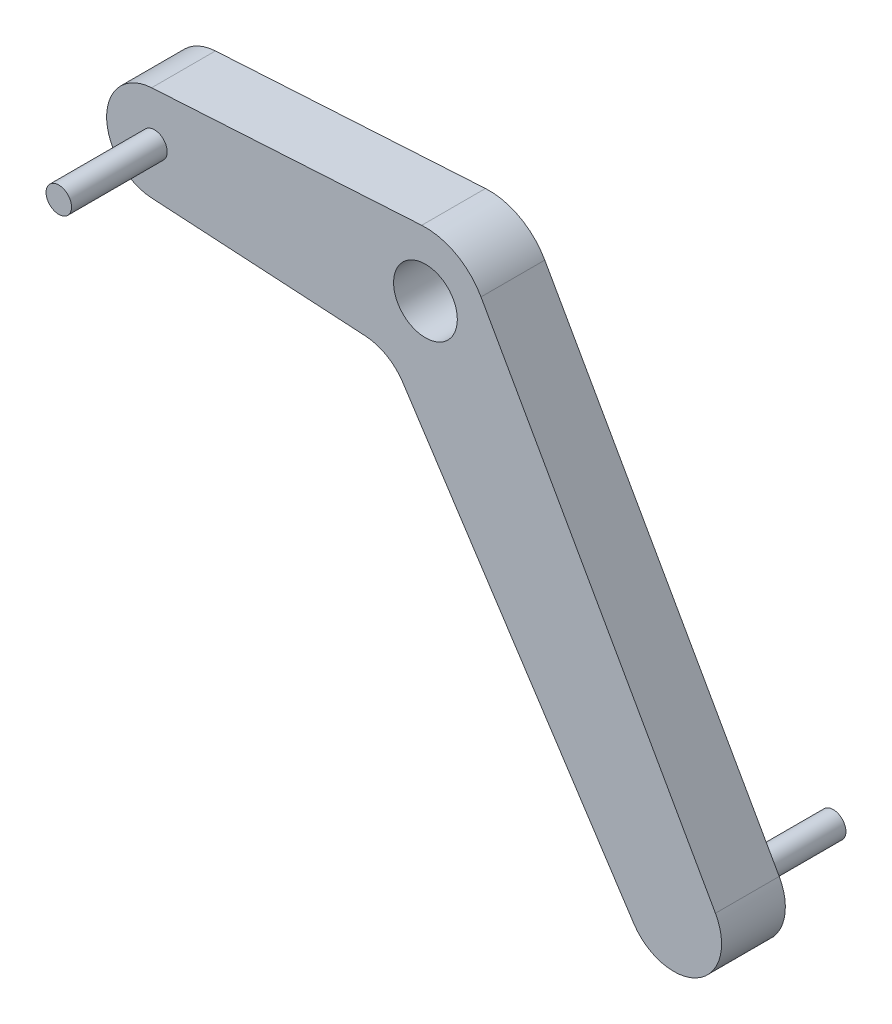
ISO-10303-21;
HEADER;
FILE_DESCRIPTION(('STEP AP214'),'2;1');
FILE_NAME('part.step','',(''),(''),'','','');
FILE_SCHEMA(('AUTOMOTIVE_DESIGN { 1 0 10303 214 1 1 1 1 }'));
ENDSEC;
DATA;
#1=APPLICATION_CONTEXT('core data for automotive mechanical design processes');
#2=APPLICATION_PROTOCOL_DEFINITION('international standard','automotive_design',2000,#1);
#3=PRODUCT_CONTEXT('',#1,'mechanical');
#4=PRODUCT('Part','Part','',(#3));
#5=PRODUCT_RELATED_PRODUCT_CATEGORY('part','',(#4));
#6=PRODUCT_DEFINITION_FORMATION('','',#4);
#7=PRODUCT_DEFINITION_CONTEXT('part definition',#1,'design');
#8=PRODUCT_DEFINITION('design','',#6,#7);
#9=PRODUCT_DEFINITION_SHAPE('','',#8);
#10=(LENGTH_UNIT() NAMED_UNIT(*) SI_UNIT(.MILLI.,.METRE.));
#11=(NAMED_UNIT(*) PLANE_ANGLE_UNIT() SI_UNIT($,.RADIAN.));
#12=(NAMED_UNIT(*) SI_UNIT($,.STERADIAN.) SOLID_ANGLE_UNIT());
#13=UNCERTAINTY_MEASURE_WITH_UNIT(LENGTH_MEASURE(1.E-05),#10,'distance_accuracy_value','');
#14=(GEOMETRIC_REPRESENTATION_CONTEXT(3) GLOBAL_UNCERTAINTY_ASSIGNED_CONTEXT((#13)) GLOBAL_UNIT_ASSIGNED_CONTEXT((#10,
#11,#12)) REPRESENTATION_CONTEXT('',''));
#15=CARTESIAN_POINT('',(0.,0.,0.));
#16=DIRECTION('',(0.,0.,1.));
#17=DIRECTION('',(1.,0.,0.));
#18=AXIS2_PLACEMENT_3D('',#15,#16,#17);
#19=CARTESIAN_POINT('',(-19.6458365275964,-33.9030692146042,20.));
#20=DIRECTION('',(0.,0.,-1.));
#21=DIRECTION('',(-1.,0.,0.));
#22=AXIS2_PLACEMENT_3D('',#19,#20,#21);
#23=CYLINDRICAL_SURFACE('',#22,15.);
#24=CARTESIAN_POINT('',(-19.6458365275964,-33.9030692146042,0.));
#25=DIRECTION('',(0.,0.,-1.));
#26=DIRECTION('',(1.,0.,0.));
#27=AXIS2_PLACEMENT_3D('',#24,#25,#26);
#28=CIRCLE('',#27,15.);
#29=CARTESIAN_POINT('',(-18.76348358642,-18.9290432600655,0.));
#30=VERTEX_POINT('',#29);
#31=CARTESIAN_POINT('',(-7.09296905018863,-25.6917649275474,0.));
#32=VERTEX_POINT('',#31);
#33=EDGE_CURVE('E147',#30,#32,#28,.T.);
#34=ORIENTED_EDGE('',*,*,#33,.T.);
#35=DIRECTION('',(0.,0.,-1.));
#36=VECTOR('',#35,1.);
#37=CARTESIAN_POINT('',(-7.09296905018863,-25.6917649275474,20.));
#38=LINE('',#37,#36);
#39=CARTESIAN_POINT('',(-7.09296905018863,-25.6917649275474,20.));
#40=VERTEX_POINT('',#39);
#41=EDGE_CURVE('E54',#40,#32,#38,.T.);
#42=ORIENTED_EDGE('',*,*,#41,.F.);
#43=CARTESIAN_POINT('',(-19.6458365275964,-33.9030692146042,20.));
#44=DIRECTION('',(0.,0.,-1.));
#45=DIRECTION('',(1.,0.,0.));
#46=AXIS2_PLACEMENT_3D('',#43,#44,#45);
#47=CIRCLE('',#46,15.);
#48=CARTESIAN_POINT('',(-18.76348358642,-18.9290432600655,20.));
#49=VERTEX_POINT('',#48);
#50=EDGE_CURVE('E170',#49,#40,#47,.T.);
#51=ORIENTED_EDGE('',*,*,#50,.F.);
#52=DIRECTION('',(0.,0.,-1.));
#53=VECTOR('',#52,1.);
#54=CARTESIAN_POINT('',(-18.76348358642,-18.9290432600655,20.));
#55=LINE('',#54,#53);
#56=EDGE_CURVE('E143',#49,#30,#55,.T.);
#57=ORIENTED_EDGE('',*,*,#56,.T.);
#58=EDGE_LOOP('',(#34,#42,#51,#57));
#59=FACE_BOUND('',#58,.T.);
#60=ADVANCED_FACE('F45',(#59),#23,.F.);
#61=CARTESIAN_POINT('',(65.330255198064,-136.407322955023,20.));
#62=DIRECTION('',(0.836857831827184,0.547420285803791,0.));
#63=DIRECTION('',(-0.547420285803791,0.836857831827184,0.));
#64=AXIS2_PLACEMENT_3D('',#61,#62,#63);
#65=PLANE('',#64);
#66=DIRECTION('',(0.547420285803791,-0.836857831827184,0.));
#67=VECTOR('',#66,1.);
#68=CARTESIAN_POINT('',(65.330255198064,-136.407322955023,0.));
#69=LINE('',#68,#67);
#70=CARTESIAN_POINT('',(65.330255198064,-136.407322955023,0.));
#71=VERTEX_POINT('',#70);
#72=EDGE_CURVE('E151',#32,#71,#69,.T.);
#73=ORIENTED_EDGE('',*,*,#72,.T.);
#74=DIRECTION('',(0.,0.,-1.));
#75=VECTOR('',#74,1.);
#76=CARTESIAN_POINT('',(65.330255198064,-136.407322955023,20.));
#77=LINE('',#76,#75);
#78=CARTESIAN_POINT('',(65.330255198064,-136.407322955023,20.));
#79=VERTEX_POINT('',#78);
#80=EDGE_CURVE('E185',#79,#71,#77,.T.);
#81=ORIENTED_EDGE('',*,*,#80,.F.);
#82=DIRECTION('',(0.547420285803791,-0.836857831827184,0.));
#83=VECTOR('',#82,1.);
#84=CARTESIAN_POINT('',(65.330255198064,-136.407322955023,20.));
#85=LINE('',#84,#83);
#86=EDGE_CURVE('E106',#40,#79,#85,.T.);
#87=ORIENTED_EDGE('',*,*,#86,.F.);
#88=ORIENTED_EDGE('',*,*,#41,.T.);
#89=EDGE_LOOP('',(#73,#81,#87,#88));
#90=FACE_BOUND('',#89,.T.);
#91=ADVANCED_FACE('F190',(#90),#65,.F.);
#92=CARTESIAN_POINT('',(77.8831226754718,-128.196018667966,20.));
#93=DIRECTION('',(0.,0.,-1.));
#94=DIRECTION('',(-1.,0.,0.));
#95=AXIS2_PLACEMENT_3D('',#92,#93,#94);
#96=CYLINDRICAL_SURFACE('',#95,15.);
#97=CARTESIAN_POINT('',(77.8831226754718,-128.196018667966,0.));
#98=DIRECTION('',(0.,0.,1.));
#99=DIRECTION('',(1.,0.,0.));
#100=AXIS2_PLACEMENT_3D('',#97,#98,#99);
#101=CIRCLE('',#100,15.);
#102=CARTESIAN_POINT('',(90.9552109707161,-120.839354505362,0.));
#103=VERTEX_POINT('',#102);
#104=EDGE_CURVE('E155',#71,#103,#101,.T.);
#105=ORIENTED_EDGE('',*,*,#104,.T.);
#106=DIRECTION('',(0.,0.,-1.));
#107=VECTOR('',#106,1.);
#108=CARTESIAN_POINT('',(90.9552109707161,-120.839354505362,20.));
#109=LINE('',#108,#107);
#110=CARTESIAN_POINT('',(90.9552109707161,-120.839354505362,20.));
#111=VERTEX_POINT('',#110);
#112=EDGE_CURVE('E181',#111,#103,#109,.T.);
#113=ORIENTED_EDGE('',*,*,#112,.F.);
#114=CARTESIAN_POINT('',(77.8831226754718,-128.196018667966,20.));
#115=DIRECTION('',(0.,0.,1.));
#116=DIRECTION('',(1.,0.,0.));
#117=AXIS2_PLACEMENT_3D('',#114,#115,#116);
#118=CIRCLE('',#117,15.);
#119=EDGE_CURVE('E209',#79,#111,#118,.T.);
#120=ORIENTED_EDGE('',*,*,#119,.F.);
#121=ORIENTED_EDGE('',*,*,#80,.T.);
#122=EDGE_LOOP('',(#105,#113,#120,#121));
#123=FACE_BOUND('',#122,.T.);
#124=ADVANCED_FACE('F201',(#123),#96,.T.);
#125=CARTESIAN_POINT('',(17.4294510603257,9.80888555013835,20.));
#126=DIRECTION('',(-0.871472553016283,-0.490444277506918,0.));
#127=DIRECTION('',(0.490444277506918,-0.871472553016283,0.));
#128=AXIS2_PLACEMENT_3D('',#125,#126,#127);
#129=PLANE('',#128);
#130=DIRECTION('',(-0.490444277506918,0.871472553016283,0.));
#131=VECTOR('',#130,1.);
#132=CARTESIAN_POINT('',(17.4294510603257,9.80888555013835,0.));
#133=LINE('',#132,#131);
#134=CARTESIAN_POINT('',(17.4294510603257,9.80888555013835,0.));
#135=VERTEX_POINT('',#134);
#136=EDGE_CURVE('E158',#103,#135,#133,.T.);
#137=ORIENTED_EDGE('',*,*,#136,.T.);
#138=DIRECTION('',(0.,0.,-1.));
#139=VECTOR('',#138,1.);
#140=CARTESIAN_POINT('',(17.4294510603257,9.80888555013835,20.));
#141=LINE('',#140,#139);
#142=CARTESIAN_POINT('',(17.4294510603257,9.80888555013835,20.));
#143=VERTEX_POINT('',#142);
#144=EDGE_CURVE('E177',#143,#135,#141,.T.);
#145=ORIENTED_EDGE('',*,*,#144,.F.);
#146=DIRECTION('',(-0.490444277506918,0.871472553016283,0.));
#147=VECTOR('',#146,1.);
#148=CARTESIAN_POINT('',(17.4294510603257,9.80888555013835,20.));
#149=LINE('',#148,#147);
#150=EDGE_CURVE('E207',#111,#143,#149,.T.);
#151=ORIENTED_EDGE('',*,*,#150,.F.);
#152=ORIENTED_EDGE('',*,*,#112,.T.);
#153=EDGE_LOOP('',(#137,#145,#151,#152));
#154=FACE_BOUND('',#153,.T.);
#155=ADVANCED_FACE('F205',(#154),#129,.F.);
#156=CARTESIAN_POINT('',(0.,0.,20.));
#157=DIRECTION('',(0.,0.,-1.));
#158=DIRECTION('',(-1.,0.,0.));
#159=AXIS2_PLACEMENT_3D('',#156,#157,#158);
#160=CYLINDRICAL_SURFACE('',#159,20.);
#161=CARTESIAN_POINT('',(0.,0.,0.));
#162=DIRECTION('',(0.,0.,1.));
#163=DIRECTION('',(1.,0.,0.));
#164=AXIS2_PLACEMENT_3D('',#161,#162,#163);
#165=CIRCLE('',#164,20.);
#166=CARTESIAN_POINT('',(-1.17647058823529,19.9653679393849,0.));
#167=VERTEX_POINT('',#166);
#168=EDGE_CURVE('E161',#135,#167,#165,.T.);
#169=ORIENTED_EDGE('',*,*,#168,.T.);
#170=DIRECTION('',(0.,0.,-1.));
#171=VECTOR('',#170,1.);
#172=CARTESIAN_POINT('',(-1.17647058823529,19.9653679393849,20.));
#173=LINE('',#172,#171);
#174=CARTESIAN_POINT('',(-1.17647058823529,19.9653679393849,20.));
#175=VERTEX_POINT('',#174);
#176=EDGE_CURVE('E136',#175,#167,#173,.T.);
#177=ORIENTED_EDGE('',*,*,#176,.F.);
#178=CARTESIAN_POINT('',(0.,0.,20.));
#179=DIRECTION('',(0.,0.,1.));
#180=DIRECTION('',(1.,0.,0.));
#181=AXIS2_PLACEMENT_3D('',#178,#179,#180);
#182=CIRCLE('',#181,20.);
#183=EDGE_CURVE('E125',#143,#175,#182,.T.);
#184=ORIENTED_EDGE('',*,*,#183,.F.);
#185=ORIENTED_EDGE('',*,*,#144,.T.);
#186=EDGE_LOOP('',(#169,#177,#184,#185));
#187=FACE_BOUND('',#186,.T.);
#188=ADVANCED_FACE('F277',(#187),#160,.T.);
#189=CARTESIAN_POINT('',(-1.17647058823529,19.9653679393849,20.));
#190=DIRECTION('',(0.0588235294117648,-0.998268396969244,0.));
#191=DIRECTION('',(0.998268396969244,0.0588235294117648,0.));
#192=AXIS2_PLACEMENT_3D('',#189,#190,#191);
#193=PLANE('',#192);
#194=DIRECTION('',(-0.998268396969244,-0.0588235294117648,0.));
#195=VECTOR('',#194,1.);
#196=CARTESIAN_POINT('',(-1.17647058823529,19.9653679393849,0.));
#197=LINE('',#196,#195);
#198=CARTESIAN_POINT('',(-85.8823529411765,14.9740259545387,0.));
#199=VERTEX_POINT('',#198);
#200=EDGE_CURVE('E134',#167,#199,#197,.T.);
#201=ORIENTED_EDGE('',*,*,#200,.T.);
#202=DIRECTION('',(0.,0.,-1.));
#203=VECTOR('',#202,1.);
#204=CARTESIAN_POINT('',(-85.8823529411765,14.9740259545387,20.));
#205=LINE('',#204,#203);
#206=CARTESIAN_POINT('',(-85.8823529411765,14.9740259545387,20.));
#207=VERTEX_POINT('',#206);
#208=EDGE_CURVE('E131',#207,#199,#205,.T.);
#209=ORIENTED_EDGE('',*,*,#208,.F.);
#210=DIRECTION('',(-0.998268396969244,-0.0588235294117648,0.));
#211=VECTOR('',#210,1.);
#212=CARTESIAN_POINT('',(-1.17647058823529,19.9653679393849,20.));
#213=LINE('',#212,#211);
#214=EDGE_CURVE('E119',#175,#207,#213,.T.);
#215=ORIENTED_EDGE('',*,*,#214,.F.);
#216=ORIENTED_EDGE('',*,*,#176,.T.);
#217=EDGE_LOOP('',(#201,#209,#215,#216));
#218=FACE_BOUND('',#217,.T.);
#219=ADVANCED_FACE('F132',(#218),#193,.F.);
#220=CARTESIAN_POINT('',(-85.,0.,20.));
#221=DIRECTION('',(0.,0.,-1.));
#222=DIRECTION('',(-1.,0.,0.));
#223=AXIS2_PLACEMENT_3D('',#220,#221,#222);
#224=CYLINDRICAL_SURFACE('',#223,15.);
#225=CARTESIAN_POINT('',(-85.,0.,0.));
#226=DIRECTION('',(0.,0.,1.));
#227=DIRECTION('',(1.,0.,0.));
#228=AXIS2_PLACEMENT_3D('',#225,#226,#227);
#229=CIRCLE('',#228,15.);
#230=CARTESIAN_POINT('',(-85.8823529411765,-14.9740259545387,0.));
#231=VERTEX_POINT('',#230);
#232=EDGE_CURVE('E91',#199,#231,#229,.T.);
#233=ORIENTED_EDGE('',*,*,#232,.T.);
#234=DIRECTION('',(0.,0.,-1.));
#235=VECTOR('',#234,1.);
#236=CARTESIAN_POINT('',(-85.8823529411765,-14.9740259545387,20.));
#237=LINE('',#236,#235);
#238=CARTESIAN_POINT('',(-85.8823529411765,-14.9740259545387,20.));
#239=VERTEX_POINT('',#238);
#240=EDGE_CURVE('E137',#239,#231,#237,.T.);
#241=ORIENTED_EDGE('',*,*,#240,.F.);
#242=CARTESIAN_POINT('',(-85.,0.,20.));
#243=DIRECTION('',(0.,0.,1.));
#244=DIRECTION('',(1.,0.,0.));
#245=AXIS2_PLACEMENT_3D('',#242,#243,#244);
#246=CIRCLE('',#245,15.);
#247=EDGE_CURVE('E123',#207,#239,#246,.T.);
#248=ORIENTED_EDGE('',*,*,#247,.F.);
#249=ORIENTED_EDGE('',*,*,#208,.T.);
#250=EDGE_LOOP('',(#233,#241,#248,#249));
#251=FACE_BOUND('',#250,.T.);
#252=ADVANCED_FACE('F139',(#251),#224,.T.);
#253=CARTESIAN_POINT('',(-85.8823529411765,-14.9740259545387,20.));
#254=DIRECTION('',(0.058823529411765,0.998268396969244,0.));
#255=DIRECTION('',(-0.998268396969244,0.058823529411765,0.));
#256=AXIS2_PLACEMENT_3D('',#253,#254,#255);
#257=PLANE('',#256);
#258=DIRECTION('',(0.998268396969244,-0.058823529411765,0.));
#259=VECTOR('',#258,1.);
#260=CARTESIAN_POINT('',(-85.8823529411765,-14.9740259545387,0.));
#261=LINE('',#260,#259);
#262=EDGE_CURVE('E97',#231,#30,#261,.T.);
#263=ORIENTED_EDGE('',*,*,#262,.T.);
#264=ORIENTED_EDGE('',*,*,#56,.F.);
#265=DIRECTION('',(0.998268396969244,-0.058823529411765,0.));
#266=VECTOR('',#265,1.);
#267=CARTESIAN_POINT('',(-85.8823529411765,-14.9740259545387,20.));
#268=LINE('',#267,#266);
#269=EDGE_CURVE('E62',#239,#49,#268,.T.);
#270=ORIENTED_EDGE('',*,*,#269,.F.);
#271=ORIENTED_EDGE('',*,*,#240,.T.);
#272=EDGE_LOOP('',(#263,#264,#270,#271));
#273=FACE_BOUND('',#272,.T.);
#274=ADVANCED_FACE('F285',(#273),#257,.F.);
#275=CARTESIAN_POINT('',(-19.6458365275964,-33.9030692146042,20.));
#276=DIRECTION('',(0.,0.,1.));
#277=DIRECTION('',(1.,0.,0.));
#278=AXIS2_PLACEMENT_3D('',#275,#276,#277);
#279=PLANE('',#278);
#280=CARTESIAN_POINT('',(-85.,0.,20.));
#281=DIRECTION('',(0.,0.,1.));
#282=DIRECTION('',(1.,0.,0.));
#283=AXIS2_PLACEMENT_3D('',#280,#281,#282);
#284=CIRCLE('',#283,4.00000000000001);
#285=CARTESIAN_POINT('',(-81.,0.,20.));
#286=VERTEX_POINT('',#285);
#287=EDGE_CURVE('E227',#286,#286,#284,.T.);
#288=ORIENTED_EDGE('',*,*,#287,.F.);
#289=EDGE_LOOP('',(#288));
#290=FACE_BOUND('',#289,.T.);
#291=CARTESIAN_POINT('',(0.,0.,20.));
#292=DIRECTION('',(0.,0.,1.));
#293=DIRECTION('',(1.,0.,0.));
#294=AXIS2_PLACEMENT_3D('',#291,#292,#293);
#295=CIRCLE('',#294,10.);
#296=CARTESIAN_POINT('',(10.,0.,20.));
#297=VERTEX_POINT('',#296);
#298=EDGE_CURVE('E152',#297,#297,#295,.T.);
#299=ORIENTED_EDGE('',*,*,#298,.F.);
#300=EDGE_LOOP('',(#299));
#301=FACE_BOUND('',#300,.T.);
#302=ORIENTED_EDGE('',*,*,#50,.T.);
#303=ORIENTED_EDGE('',*,*,#86,.T.);
#304=ORIENTED_EDGE('',*,*,#119,.T.);
#305=ORIENTED_EDGE('',*,*,#150,.T.);
#306=ORIENTED_EDGE('',*,*,#183,.T.);
#307=ORIENTED_EDGE('',*,*,#214,.T.);
#308=ORIENTED_EDGE('',*,*,#247,.T.);
#309=ORIENTED_EDGE('',*,*,#269,.T.);
#310=EDGE_LOOP('',(#302,#303,#304,#305,#306,#307,#308,#309));
#311=FACE_BOUND('',#310,.T.);
#312=ADVANCED_FACE('F121',(#290,#301,#311),#279,.T.);
#313=CARTESIAN_POINT('',(-19.6458365275964,-33.9030692146042,0.));
#314=DIRECTION('',(0.,0.,1.));
#315=DIRECTION('',(1.,0.,0.));
#316=AXIS2_PLACEMENT_3D('',#313,#314,#315);
#317=PLANE('',#316);
#318=CARTESIAN_POINT('',(77.8831226754718,-128.196018667966,0.));
#319=DIRECTION('',(0.,0.,1.));
#320=DIRECTION('',(1.,0.,0.));
#321=AXIS2_PLACEMENT_3D('',#318,#319,#320);
#322=CIRCLE('',#321,4.00000000000001);
#323=CARTESIAN_POINT('',(81.8831226754718,-128.196018667966,0.));
#324=VERTEX_POINT('',#323);
#325=EDGE_CURVE('E11',#324,#324,#322,.F.);
#326=ORIENTED_EDGE('',*,*,#325,.F.);
#327=EDGE_LOOP('',(#326));
#328=FACE_BOUND('',#327,.T.);
#329=CARTESIAN_POINT('',(0.,0.,0.));
#330=DIRECTION('',(0.,0.,1.));
#331=DIRECTION('',(1.,0.,0.));
#332=AXIS2_PLACEMENT_3D('',#329,#330,#331);
#333=CIRCLE('',#332,10.);
#334=CARTESIAN_POINT('',(10.,0.,0.));
#335=VERTEX_POINT('',#334);
#336=EDGE_CURVE('E219',#335,#335,#333,.T.);
#337=ORIENTED_EDGE('',*,*,#336,.T.);
#338=EDGE_LOOP('',(#337));
#339=FACE_BOUND('',#338,.T.);
#340=ORIENTED_EDGE('',*,*,#33,.F.);
#341=ORIENTED_EDGE('',*,*,#262,.F.);
#342=ORIENTED_EDGE('',*,*,#232,.F.);
#343=ORIENTED_EDGE('',*,*,#200,.F.);
#344=ORIENTED_EDGE('',*,*,#168,.F.);
#345=ORIENTED_EDGE('',*,*,#136,.F.);
#346=ORIENTED_EDGE('',*,*,#104,.F.);
#347=ORIENTED_EDGE('',*,*,#72,.F.);
#348=EDGE_LOOP('',(#340,#341,#342,#343,#344,#345,#346,#347));
#349=FACE_BOUND('',#348,.T.);
#350=ADVANCED_FACE('F195',(#328,#339,#349),#317,.F.);
#351=CARTESIAN_POINT('',(0.,0.,20.));
#352=DIRECTION('',(0.,0.,-1.));
#353=DIRECTION('',(-1.,0.,0.));
#354=AXIS2_PLACEMENT_3D('',#351,#352,#353);
#355=CYLINDRICAL_SURFACE('',#354,10.);
#356=ORIENTED_EDGE('',*,*,#298,.T.);
#357=EDGE_LOOP('',(#356));
#358=FACE_BOUND('',#357,.T.);
#359=ORIENTED_EDGE('',*,*,#336,.F.);
#360=EDGE_LOOP('',(#359));
#361=FACE_BOUND('',#360,.T.);
#362=ADVANCED_FACE('F250',(#358,#361),#355,.F.);
#363=CARTESIAN_POINT('',(-85.,0.,50.));
#364=DIRECTION('',(0.,0.,-1.));
#365=DIRECTION('',(-1.,0.,0.));
#366=AXIS2_PLACEMENT_3D('',#363,#364,#365);
#367=CYLINDRICAL_SURFACE('',#366,4.00000000000001);
#368=CARTESIAN_POINT('',(-85.,0.,50.));
#369=DIRECTION('',(0.,0.,1.));
#370=DIRECTION('',(1.,0.,0.));
#371=AXIS2_PLACEMENT_3D('',#368,#369,#370);
#372=CIRCLE('',#371,4.00000000000001);
#373=CARTESIAN_POINT('',(-81.,0.,50.));
#374=VERTEX_POINT('',#373);
#375=EDGE_CURVE('E223',#374,#374,#372,.T.);
#376=ORIENTED_EDGE('',*,*,#375,.F.);
#377=EDGE_LOOP('',(#376));
#378=FACE_BOUND('',#377,.T.);
#379=ORIENTED_EDGE('',*,*,#287,.T.);
#380=EDGE_LOOP('',(#379));
#381=FACE_BOUND('',#380,.T.);
#382=ADVANCED_FACE('F255',(#378,#381),#367,.T.);
#383=CARTESIAN_POINT('',(-85.,0.,50.));
#384=DIRECTION('',(0.,0.,1.));
#385=DIRECTION('',(1.,0.,0.));
#386=AXIS2_PLACEMENT_3D('',#383,#384,#385);
#387=PLANE('',#386);
#388=ORIENTED_EDGE('',*,*,#375,.T.);
#389=EDGE_LOOP('',(#388));
#390=FACE_BOUND('',#389,.T.);
#391=ADVANCED_FACE('F244',(#390),#387,.T.);
#392=CARTESIAN_POINT('',(77.8831226754718,-128.196018667966,-30.));
#393=DIRECTION('',(0.,0.,1.));
#394=DIRECTION('',(1.,0.,0.));
#395=AXIS2_PLACEMENT_3D('',#392,#393,#394);
#396=CYLINDRICAL_SURFACE('',#395,4.00000000000001);
#397=CARTESIAN_POINT('',(77.8831226754718,-128.196018667966,-30.));
#398=DIRECTION('',(0.,0.,-1.));
#399=DIRECTION('',(-1.,0.,0.));
#400=AXIS2_PLACEMENT_3D('',#397,#398,#399);
#401=CIRCLE('',#400,4.00000000000001);
#402=CARTESIAN_POINT('',(73.8831226754718,-128.196018667966,-30.));
#403=VERTEX_POINT('',#402);
#404=EDGE_CURVE('E231',#403,#403,#401,.T.);
#405=ORIENTED_EDGE('',*,*,#404,.F.);
#406=EDGE_LOOP('',(#405));
#407=FACE_BOUND('',#406,.T.);
#408=ORIENTED_EDGE('',*,*,#325,.T.);
#409=EDGE_LOOP('',(#408));
#410=FACE_BOUND('',#409,.T.);
#411=ADVANCED_FACE('F241',(#407,#410),#396,.T.);
#412=CARTESIAN_POINT('',(77.8831226754718,-128.196018667966,-30.));
#413=DIRECTION('',(0.,0.,-1.));
#414=DIRECTION('',(-1.,0.,0.));
#415=AXIS2_PLACEMENT_3D('',#412,#413,#414);
#416=PLANE('',#415);
#417=ORIENTED_EDGE('',*,*,#404,.T.);
#418=EDGE_LOOP('',(#417));
#419=FACE_BOUND('',#418,.T.);
#420=ADVANCED_FACE('F239',(#419),#416,.T.);
#421=CLOSED_SHELL('',(#60,#91,#124,#155,#188,#219,#252,#274,#312,#350,#362,#382,#391,#411,#420));
#422=MANIFOLD_SOLID_BREP('B2',#421);
#423=ADVANCED_BREP_SHAPE_REPRESENTATION('',(#18,#422),#14);
#424=SHAPE_DEFINITION_REPRESENTATION(#9,#423);
ENDSEC;
END-ISO-10303-21;
